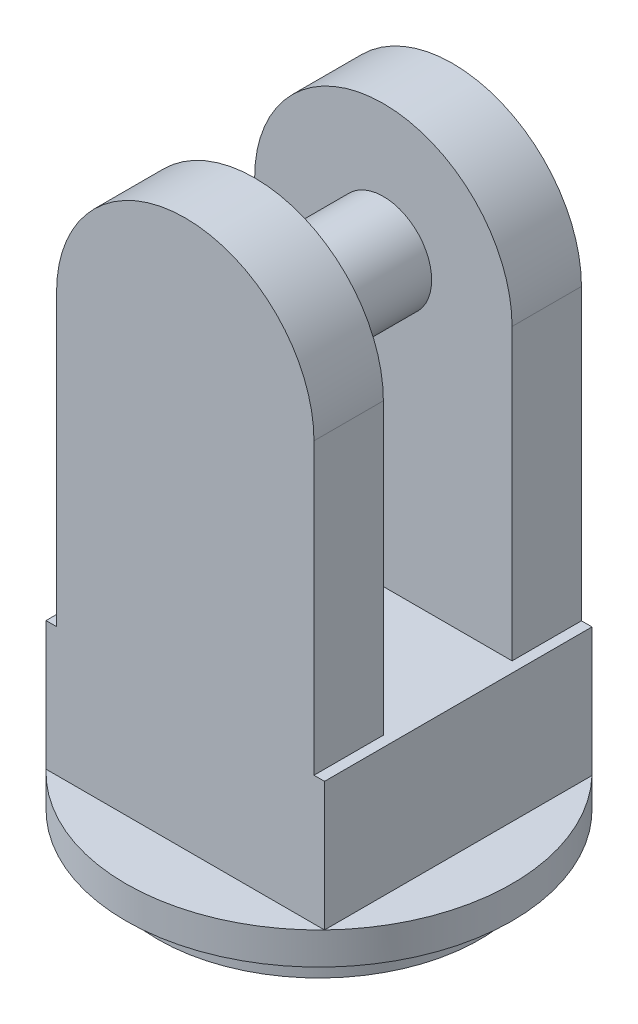
ISO-10303-21;
HEADER;
FILE_DESCRIPTION(('STEP AP214'),'2;1');
FILE_NAME('part.step','',(''),(''),'','','');
FILE_SCHEMA(('AUTOMOTIVE_DESIGN { 1 0 10303 214 1 1 1 1 }'));
ENDSEC;
DATA;
#1=APPLICATION_CONTEXT('core data for automotive mechanical design processes');
#2=APPLICATION_PROTOCOL_DEFINITION('international standard','automotive_design',2000,#1);
#3=PRODUCT_CONTEXT('',#1,'mechanical');
#4=PRODUCT('Part','Part','',(#3));
#5=PRODUCT_RELATED_PRODUCT_CATEGORY('part','',(#4));
#6=PRODUCT_DEFINITION_FORMATION('','',#4);
#7=PRODUCT_DEFINITION_CONTEXT('part definition',#1,'design');
#8=PRODUCT_DEFINITION('design','',#6,#7);
#9=PRODUCT_DEFINITION_SHAPE('','',#8);
#10=(LENGTH_UNIT() NAMED_UNIT(*) SI_UNIT(.MILLI.,.METRE.));
#11=(NAMED_UNIT(*) PLANE_ANGLE_UNIT() SI_UNIT($,.RADIAN.));
#12=(NAMED_UNIT(*) SI_UNIT($,.STERADIAN.) SOLID_ANGLE_UNIT());
#13=UNCERTAINTY_MEASURE_WITH_UNIT(LENGTH_MEASURE(1.E-05),#10,'distance_accuracy_value','');
#14=(GEOMETRIC_REPRESENTATION_CONTEXT(3) GLOBAL_UNCERTAINTY_ASSIGNED_CONTEXT((#13)) GLOBAL_UNIT_ASSIGNED_CONTEXT((#10,
#11,#12)) REPRESENTATION_CONTEXT('',''));
#15=CARTESIAN_POINT('',(0.,0.,0.));
#16=DIRECTION('',(0.,0.,1.));
#17=DIRECTION('',(1.,0.,0.));
#18=AXIS2_PLACEMENT_3D('',#15,#16,#17);
#19=CARTESIAN_POINT('',(-40.,60.,-229.445191334627));
#20=DIRECTION('',(-1.,0.,0.));
#21=DIRECTION('',(0.,0.,1.));
#22=AXIS2_PLACEMENT_3D('',#19,#20,#21);
#23=PLANE('',#22);
#24=DIRECTION('',(0.,1.,0.));
#25=VECTOR('',#24,1.);
#26=CARTESIAN_POINT('',(-40.,240.,20.));
#27=LINE('',#26,#25);
#28=CARTESIAN_POINT('',(-40.,60.,20.));
#29=VERTEX_POINT('',#28);
#30=CARTESIAN_POINT('',(-40.,150.,20.));
#31=VERTEX_POINT('',#30);
#32=EDGE_CURVE('E141',#29,#31,#27,.T.);
#33=ORIENTED_EDGE('',*,*,#32,.F.);
#34=DIRECTION('',(0.,0.,1.));
#35=VECTOR('',#34,1.);
#36=CARTESIAN_POINT('',(-40.,60.,-229.445191334627));
#37=LINE('',#36,#35);
#38=CARTESIAN_POINT('',(-40.,60.,41.5622490540678));
#39=VERTEX_POINT('',#38);
#40=EDGE_CURVE('E146',#29,#39,#37,.T.);
#41=ORIENTED_EDGE('',*,*,#40,.T.);
#42=DIRECTION('',(0.,-1.,0.));
#43=VECTOR('',#42,1.);
#44=CARTESIAN_POINT('',(-40.,60.,41.5622490540678));
#45=LINE('',#44,#43);
#46=CARTESIAN_POINT('',(-40.,150.,41.5622490540678));
#47=VERTEX_POINT('',#46);
#48=EDGE_CURVE('E152',#47,#39,#45,.T.);
#49=ORIENTED_EDGE('',*,*,#48,.F.);
#50=DIRECTION('',(0.,0.,1.));
#51=VECTOR('',#50,1.);
#52=CARTESIAN_POINT('',(-40.,150.,-229.445191334627));
#53=LINE('',#52,#51);
#54=EDGE_CURVE('E155',#31,#47,#53,.T.);
#55=ORIENTED_EDGE('',*,*,#54,.F.);
#56=EDGE_LOOP('',(#33,#41,#49,#55));
#57=FACE_BOUND('',#56,.T.);
#58=ADVANCED_FACE('F37',(#57),#23,.T.);
#59=CARTESIAN_POINT('',(0.,150.,-229.445191334627));
#60=DIRECTION('',(0.,0.,1.));
#61=DIRECTION('',(1.,0.,0.));
#62=AXIS2_PLACEMENT_3D('',#59,#60,#61);
#63=CYLINDRICAL_SURFACE('',#62,40.);
#64=CARTESIAN_POINT('',(0.,150.,20.));
#65=DIRECTION('',(0.,0.,1.));
#66=DIRECTION('',(0.,-1.,0.));
#67=AXIS2_PLACEMENT_3D('',#64,#65,#66);
#68=CIRCLE('',#67,40.);
#69=CARTESIAN_POINT('',(40.,150.,20.));
#70=VERTEX_POINT('',#69);
#71=EDGE_CURVE('E222',#31,#70,#68,.F.);
#72=ORIENTED_EDGE('',*,*,#71,.F.);
#73=ORIENTED_EDGE('',*,*,#54,.T.);
#74=CARTESIAN_POINT('',(0.,150.,41.5622490540678));
#75=DIRECTION('',(0.,0.,1.));
#76=DIRECTION('',(1.,0.,0.));
#77=AXIS2_PLACEMENT_3D('',#74,#75,#76);
#78=CIRCLE('',#77,40.);
#79=CARTESIAN_POINT('',(40.,150.,41.5622490540678));
#80=VERTEX_POINT('',#79);
#81=EDGE_CURVE('E235',#80,#47,#78,.T.);
#82=ORIENTED_EDGE('',*,*,#81,.F.);
#83=DIRECTION('',(0.,0.,1.));
#84=VECTOR('',#83,1.);
#85=CARTESIAN_POINT('',(40.,150.,-229.445191334627));
#86=LINE('',#85,#84);
#87=EDGE_CURVE('E159',#70,#80,#86,.T.);
#88=ORIENTED_EDGE('',*,*,#87,.F.);
#89=EDGE_LOOP('',(#72,#73,#82,#88));
#90=FACE_BOUND('',#89,.T.);
#91=ADVANCED_FACE('F279',(#90),#63,.T.);
#92=CARTESIAN_POINT('',(40.,60.,-229.445191334627));
#93=DIRECTION('',(1.,0.,0.));
#94=DIRECTION('',(0.,0.,-1.));
#95=AXIS2_PLACEMENT_3D('',#92,#93,#94);
#96=PLANE('',#95);
#97=DIRECTION('',(0.,-1.,0.));
#98=VECTOR('',#97,1.);
#99=CARTESIAN_POINT('',(40.,60.,20.));
#100=LINE('',#99,#98);
#101=CARTESIAN_POINT('',(40.,60.,20.));
#102=VERTEX_POINT('',#101);
#103=EDGE_CURVE('E11',#70,#102,#100,.T.);
#104=ORIENTED_EDGE('',*,*,#103,.F.);
#105=ORIENTED_EDGE('',*,*,#87,.T.);
#106=DIRECTION('',(0.,1.,0.));
#107=VECTOR('',#106,1.);
#108=CARTESIAN_POINT('',(40.,60.,41.5622490540678));
#109=LINE('',#108,#107);
#110=CARTESIAN_POINT('',(40.,60.,41.5622490540678));
#111=VERTEX_POINT('',#110);
#112=EDGE_CURVE('E233',#111,#80,#109,.T.);
#113=ORIENTED_EDGE('',*,*,#112,.F.);
#114=DIRECTION('',(0.,0.,1.));
#115=VECTOR('',#114,1.);
#116=CARTESIAN_POINT('',(40.,60.,-229.445191334627));
#117=LINE('',#116,#115);
#118=EDGE_CURVE('E60',#102,#111,#117,.T.);
#119=ORIENTED_EDGE('',*,*,#118,.F.);
#120=EDGE_LOOP('',(#104,#105,#113,#119));
#121=FACE_BOUND('',#120,.T.);
#122=ADVANCED_FACE('F275',(#121),#96,.T.);
#123=CARTESIAN_POINT('',(0.,20.,0.));
#124=DIRECTION('',(0.,1.,0.));
#125=DIRECTION('',(0.,0.,1.));
#126=AXIS2_PLACEMENT_3D('',#123,#124,#125);
#127=PLANE('',#126);
#128=DIRECTION('',(0.,0.,-1.));
#129=VECTOR('',#128,1.);
#130=CARTESIAN_POINT('',(43.2733111001185,20.,-41.5622490540678));
#131=LINE('',#130,#129);
#132=CARTESIAN_POINT('',(43.2733111001185,20.,41.5622490540678));
#133=VERTEX_POINT('',#132);
#134=CARTESIAN_POINT('',(43.2733111001185,20.,-41.5622490540678));
#135=VERTEX_POINT('',#134);
#136=EDGE_CURVE('E164',#133,#135,#131,.T.);
#137=ORIENTED_EDGE('',*,*,#136,.F.);
#138=CARTESIAN_POINT('',(0.,20.,0.));
#139=DIRECTION('',(0.,1.,0.));
#140=DIRECTION('',(0.,0.,1.));
#141=AXIS2_PLACEMENT_3D('',#138,#139,#140);
#142=CIRCLE('',#141,60.);
#143=EDGE_CURVE('E198',#133,#135,#142,.T.);
#144=ORIENTED_EDGE('',*,*,#143,.T.);
#145=EDGE_LOOP('',(#137,#144));
#146=FACE_BOUND('',#145,.T.);
#147=ADVANCED_FACE('F259',(#146),#127,.T.);
#148=DIRECTION('',(1.,0.,0.));
#149=VECTOR('',#148,1.);
#150=CARTESIAN_POINT('',(-43.2733111001185,20.,41.5622490540678));
#151=LINE('',#150,#149);
#152=CARTESIAN_POINT('',(-43.2733111001185,20.,41.5622490540678));
#153=VERTEX_POINT('',#152);
#154=EDGE_CURVE('E168',#153,#133,#151,.T.);
#155=ORIENTED_EDGE('',*,*,#154,.F.);
#156=EDGE_CURVE('E203',#153,#133,#142,.T.);
#157=ORIENTED_EDGE('',*,*,#156,.T.);
#158=EDGE_LOOP('',(#155,#157));
#159=FACE_BOUND('',#158,.T.);
#160=ADVANCED_FACE('F262',(#159),#127,.T.);
#161=DIRECTION('',(0.,0.,1.));
#162=VECTOR('',#161,1.);
#163=CARTESIAN_POINT('',(-43.2733111001185,20.,-41.5622490540678));
#164=LINE('',#163,#162);
#165=CARTESIAN_POINT('',(-43.2733111001185,20.,-41.5622490540678));
#166=VERTEX_POINT('',#165);
#167=EDGE_CURVE('E182',#166,#153,#164,.T.);
#168=ORIENTED_EDGE('',*,*,#167,.F.);
#169=EDGE_CURVE('E266',#166,#153,#142,.T.);
#170=ORIENTED_EDGE('',*,*,#169,.T.);
#171=EDGE_LOOP('',(#168,#170));
#172=FACE_BOUND('',#171,.T.);
#173=ADVANCED_FACE('F334',(#172),#127,.T.);
#174=CARTESIAN_POINT('',(0.,10.,0.));
#175=DIRECTION('',(0.,-1.,0.));
#176=DIRECTION('',(0.,0.,-1.));
#177=AXIS2_PLACEMENT_3D('',#174,#175,#176);
#178=CYLINDRICAL_SURFACE('',#177,50.);
#179=CARTESIAN_POINT('',(0.,10.,0.));
#180=DIRECTION('',(0.,1.,0.));
#181=DIRECTION('',(0.,0.,1.));
#182=AXIS2_PLACEMENT_3D('',#179,#180,#181);
#183=CIRCLE('',#182,50.);
#184=CARTESIAN_POINT('',(0.,10.,50.));
#185=VERTEX_POINT('',#184);
#186=EDGE_CURVE('E212',#185,#185,#183,.T.);
#187=ORIENTED_EDGE('',*,*,#186,.F.);
#188=EDGE_LOOP('',(#187));
#189=FACE_BOUND('',#188,.T.);
#190=CARTESIAN_POINT('',(0.,0.,0.));
#191=DIRECTION('',(0.,1.,0.));
#192=DIRECTION('',(0.,0.,1.));
#193=AXIS2_PLACEMENT_3D('',#190,#191,#192);
#194=CIRCLE('',#193,50.);
#195=CARTESIAN_POINT('',(0.,0.,50.));
#196=VERTEX_POINT('',#195);
#197=EDGE_CURVE('E209',#196,#196,#194,.T.);
#198=ORIENTED_EDGE('',*,*,#197,.T.);
#199=EDGE_LOOP('',(#198));
#200=FACE_BOUND('',#199,.T.);
#201=ADVANCED_FACE('F39',(#189,#200),#178,.T.);
#202=CARTESIAN_POINT('',(0.,0.,0.));
#203=DIRECTION('',(0.,1.,0.));
#204=DIRECTION('',(0.,0.,1.));
#205=AXIS2_PLACEMENT_3D('',#202,#203,#204);
#206=PLANE('',#205);
#207=CARTESIAN_POINT('',(0.,0.,0.));
#208=DIRECTION('',(0.,1.,0.));
#209=DIRECTION('',(0.,0.,1.));
#210=AXIS2_PLACEMENT_3D('',#207,#208,#209);
#211=CIRCLE('',#210,15.);
#212=CARTESIAN_POINT('',(0.,0.,15.));
#213=VERTEX_POINT('',#212);
#214=EDGE_CURVE('E206',#213,#213,#211,.T.);
#215=ORIENTED_EDGE('',*,*,#214,.T.);
#216=EDGE_LOOP('',(#215));
#217=FACE_BOUND('',#216,.T.);
#218=ORIENTED_EDGE('',*,*,#197,.F.);
#219=EDGE_LOOP('',(#218));
#220=FACE_BOUND('',#219,.T.);
#221=ADVANCED_FACE('F342',(#217,#220),#206,.F.);
#222=CARTESIAN_POINT('',(0.,0.,0.));
#223=DIRECTION('',(0.,1.,0.));
#224=DIRECTION('',(0.,0.,1.));
#225=AXIS2_PLACEMENT_3D('',#222,#223,#224);
#226=CYLINDRICAL_SURFACE('',#225,15.);
#227=ORIENTED_EDGE('',*,*,#214,.F.);
#228=EDGE_LOOP('',(#227));
#229=FACE_BOUND('',#228,.T.);
#230=CARTESIAN_POINT('',(0.,10.,0.));
#231=DIRECTION('',(0.,1.,0.));
#232=DIRECTION('',(0.,0.,1.));
#233=AXIS2_PLACEMENT_3D('',#230,#231,#232);
#234=CIRCLE('',#233,15.);
#235=CARTESIAN_POINT('',(0.,10.,15.));
#236=VERTEX_POINT('',#235);
#237=EDGE_CURVE('E201',#236,#236,#234,.T.);
#238=ORIENTED_EDGE('',*,*,#237,.T.);
#239=EDGE_LOOP('',(#238));
#240=FACE_BOUND('',#239,.T.);
#241=ADVANCED_FACE('F337',(#229,#240),#226,.F.);
#242=CARTESIAN_POINT('',(0.,10.,0.));
#243=DIRECTION('',(0.,1.,0.));
#244=DIRECTION('',(0.,0.,1.));
#245=AXIS2_PLACEMENT_3D('',#242,#243,#244);
#246=PLANE('',#245);
#247=ORIENTED_EDGE('',*,*,#186,.T.);
#248=EDGE_LOOP('',(#247));
#249=FACE_BOUND('',#248,.T.);
#250=CARTESIAN_POINT('',(0.,10.,0.));
#251=DIRECTION('',(0.,1.,0.));
#252=DIRECTION('',(0.,0.,1.));
#253=AXIS2_PLACEMENT_3D('',#250,#251,#252);
#254=CIRCLE('',#253,60.);
#255=CARTESIAN_POINT('',(0.,10.,60.));
#256=VERTEX_POINT('',#255);
#257=EDGE_CURVE('E197',#256,#256,#254,.T.);
#258=ORIENTED_EDGE('',*,*,#257,.F.);
#259=EDGE_LOOP('',(#258));
#260=FACE_BOUND('',#259,.T.);
#261=ADVANCED_FACE('F332',(#249,#260),#246,.F.);
#262=DIRECTION('',(-1.,0.,0.));
#263=VECTOR('',#262,1.);
#264=CARTESIAN_POINT('',(-43.2733111001185,20.,-41.5622490540678));
#265=LINE('',#264,#263);
#266=EDGE_CURVE('E180',#135,#166,#265,.T.);
#267=ORIENTED_EDGE('',*,*,#266,.F.);
#268=EDGE_CURVE('E202',#135,#166,#142,.T.);
#269=ORIENTED_EDGE('',*,*,#268,.T.);
#270=EDGE_LOOP('',(#267,#269));
#271=FACE_BOUND('',#270,.T.);
#272=ADVANCED_FACE('F329',(#271),#127,.T.);
#273=CARTESIAN_POINT('',(0.,20.,0.));
#274=DIRECTION('',(0.,-1.,0.));
#275=DIRECTION('',(0.,0.,-1.));
#276=AXIS2_PLACEMENT_3D('',#273,#274,#275);
#277=CYLINDRICAL_SURFACE('',#276,60.);
#278=ORIENTED_EDGE('',*,*,#143,.F.);
#279=ORIENTED_EDGE('',*,*,#156,.F.);
#280=ORIENTED_EDGE('',*,*,#169,.F.);
#281=ORIENTED_EDGE('',*,*,#268,.F.);
#282=EDGE_LOOP('',(#278,#279,#280,#281));
#283=FACE_BOUND('',#282,.T.);
#284=ORIENTED_EDGE('',*,*,#257,.T.);
#285=EDGE_LOOP('',(#284));
#286=FACE_BOUND('',#285,.T.);
#287=ADVANCED_FACE('F268',(#283,#286),#277,.T.);
#288=ORIENTED_EDGE('',*,*,#237,.F.);
#289=EDGE_LOOP('',(#288));
#290=FACE_BOUND('',#289,.T.);
#291=ADVANCED_FACE('F328',(#290),#246,.F.);
#292=CARTESIAN_POINT('',(43.2733111001185,60.,-41.5622490540678));
#293=DIRECTION('',(-1.,0.,0.));
#294=DIRECTION('',(0.,0.,1.));
#295=AXIS2_PLACEMENT_3D('',#292,#293,#294);
#296=PLANE('',#295);
#297=ORIENTED_EDGE('',*,*,#136,.T.);
#298=DIRECTION('',(0.,-1.,0.));
#299=VECTOR('',#298,1.);
#300=CARTESIAN_POINT('',(43.2733111001185,60.,-41.5622490540678));
#301=LINE('',#300,#299);
#302=CARTESIAN_POINT('',(43.2733111001185,60.,-41.5622490540678));
#303=VERTEX_POINT('',#302);
#304=EDGE_CURVE('E194',#303,#135,#301,.T.);
#305=ORIENTED_EDGE('',*,*,#304,.F.);
#306=DIRECTION('',(0.,0.,-1.));
#307=VECTOR('',#306,1.);
#308=CARTESIAN_POINT('',(43.2733111001185,60.,-41.5622490540678));
#309=LINE('',#308,#307);
#310=CARTESIAN_POINT('',(43.2733111001185,60.,41.5622490540678));
#311=VERTEX_POINT('',#310);
#312=EDGE_CURVE('E165',#311,#303,#309,.T.);
#313=ORIENTED_EDGE('',*,*,#312,.F.);
#314=DIRECTION('',(0.,-1.,0.));
#315=VECTOR('',#314,1.);
#316=CARTESIAN_POINT('',(43.2733111001185,60.,41.5622490540678));
#317=LINE('',#316,#315);
#318=EDGE_CURVE('E177',#311,#133,#317,.T.);
#319=ORIENTED_EDGE('',*,*,#318,.T.);
#320=EDGE_LOOP('',(#297,#305,#313,#319));
#321=FACE_BOUND('',#320,.T.);
#322=ADVANCED_FACE('F271',(#321),#296,.F.);
#323=CARTESIAN_POINT('',(-43.2733111001185,60.,-41.5622490540678));
#324=DIRECTION('',(0.,0.,1.));
#325=DIRECTION('',(1.,0.,0.));
#326=AXIS2_PLACEMENT_3D('',#323,#324,#325);
#327=PLANE('',#326);
#328=ORIENTED_EDGE('',*,*,#266,.T.);
#329=DIRECTION('',(0.,-1.,0.));
#330=VECTOR('',#329,1.);
#331=CARTESIAN_POINT('',(-43.2733111001185,60.,-41.5622490540678));
#332=LINE('',#331,#330);
#333=CARTESIAN_POINT('',(-43.2733111001185,60.,-41.5622490540678));
#334=VERTEX_POINT('',#333);
#335=EDGE_CURVE('E191',#334,#166,#332,.T.);
#336=ORIENTED_EDGE('',*,*,#335,.F.);
#337=DIRECTION('',(-1.,0.,0.));
#338=VECTOR('',#337,1.);
#339=CARTESIAN_POINT('',(-43.2733111001185,60.,-41.5622490540678));
#340=LINE('',#339,#338);
#341=CARTESIAN_POINT('',(-40.,60.,-41.5622490540678));
#342=VERTEX_POINT('',#341);
#343=EDGE_CURVE('E167',#342,#334,#340,.T.);
#344=ORIENTED_EDGE('',*,*,#343,.F.);
#345=DIRECTION('',(0.,1.,0.));
#346=VECTOR('',#345,1.);
#347=CARTESIAN_POINT('',(-40.,60.,-41.5622490540678));
#348=LINE('',#347,#346);
#349=CARTESIAN_POINT('',(-40.,150.,-41.5622490540678));
#350=VERTEX_POINT('',#349);
#351=EDGE_CURVE('E144',#342,#350,#348,.T.);
#352=ORIENTED_EDGE('',*,*,#351,.T.);
#353=CARTESIAN_POINT('',(0.,150.,-41.5622490540678));
#354=DIRECTION('',(0.,0.,1.));
#355=DIRECTION('',(1.,0.,0.));
#356=AXIS2_PLACEMENT_3D('',#353,#354,#355);
#357=CIRCLE('',#356,40.);
#358=CARTESIAN_POINT('',(40.,150.,-41.5622490540678));
#359=VERTEX_POINT('',#358);
#360=EDGE_CURVE('E145',#350,#359,#357,.F.);
#361=ORIENTED_EDGE('',*,*,#360,.T.);
#362=DIRECTION('',(0.,-1.,0.));
#363=VECTOR('',#362,1.);
#364=CARTESIAN_POINT('',(40.,60.,-41.5622490540678));
#365=LINE('',#364,#363);
#366=CARTESIAN_POINT('',(40.,60.,-41.5622490540678));
#367=VERTEX_POINT('',#366);
#368=EDGE_CURVE('E161',#359,#367,#365,.T.);
#369=ORIENTED_EDGE('',*,*,#368,.T.);
#370=EDGE_CURVE('E169',#303,#367,#340,.T.);
#371=ORIENTED_EDGE('',*,*,#370,.F.);
#372=ORIENTED_EDGE('',*,*,#304,.T.);
#373=EDGE_LOOP('',(#328,#336,#344,#352,#361,#369,#371,#372));
#374=FACE_BOUND('',#373,.T.);
#375=ADVANCED_FACE('F227',(#374),#327,.F.);
#376=CARTESIAN_POINT('',(-43.2733111001185,60.,-41.5622490540678));
#377=DIRECTION('',(1.,0.,0.));
#378=DIRECTION('',(0.,0.,-1.));
#379=AXIS2_PLACEMENT_3D('',#376,#377,#378);
#380=PLANE('',#379);
#381=ORIENTED_EDGE('',*,*,#167,.T.);
#382=DIRECTION('',(0.,-1.,0.));
#383=VECTOR('',#382,1.);
#384=CARTESIAN_POINT('',(-43.2733111001185,60.,41.5622490540678));
#385=LINE('',#384,#383);
#386=CARTESIAN_POINT('',(-43.2733111001185,60.,41.5622490540678));
#387=VERTEX_POINT('',#386);
#388=EDGE_CURVE('E188',#387,#153,#385,.T.);
#389=ORIENTED_EDGE('',*,*,#388,.F.);
#390=DIRECTION('',(0.,0.,1.));
#391=VECTOR('',#390,1.);
#392=CARTESIAN_POINT('',(-43.2733111001185,60.,-41.5622490540678));
#393=LINE('',#392,#391);
#394=EDGE_CURVE('E171',#334,#387,#393,.T.);
#395=ORIENTED_EDGE('',*,*,#394,.F.);
#396=ORIENTED_EDGE('',*,*,#335,.T.);
#397=EDGE_LOOP('',(#381,#389,#395,#396));
#398=FACE_BOUND('',#397,.T.);
#399=ADVANCED_FACE('F250',(#398),#380,.F.);
#400=CARTESIAN_POINT('',(-43.2733111001185,60.,41.5622490540678));
#401=DIRECTION('',(0.,0.,-1.));
#402=DIRECTION('',(-1.,0.,0.));
#403=AXIS2_PLACEMENT_3D('',#400,#401,#402);
#404=PLANE('',#403);
#405=ORIENTED_EDGE('',*,*,#154,.T.);
#406=ORIENTED_EDGE('',*,*,#318,.F.);
#407=DIRECTION('',(1.,0.,0.));
#408=VECTOR('',#407,1.);
#409=CARTESIAN_POINT('',(-43.2733111001185,60.,41.5622490540678));
#410=LINE('',#409,#408);
#411=EDGE_CURVE('E173',#111,#311,#410,.T.);
#412=ORIENTED_EDGE('',*,*,#411,.F.);
#413=ORIENTED_EDGE('',*,*,#112,.T.);
#414=ORIENTED_EDGE('',*,*,#81,.T.);
#415=ORIENTED_EDGE('',*,*,#48,.T.);
#416=EDGE_CURVE('E174',#387,#39,#410,.T.);
#417=ORIENTED_EDGE('',*,*,#416,.F.);
#418=ORIENTED_EDGE('',*,*,#388,.T.);
#419=EDGE_LOOP('',(#405,#406,#412,#413,#414,#415,#417,#418));
#420=FACE_BOUND('',#419,.T.);
#421=ADVANCED_FACE('F242',(#420),#404,.F.);
#422=CARTESIAN_POINT('',(0.,60.,0.));
#423=DIRECTION('',(0.,1.,0.));
#424=DIRECTION('',(0.,0.,1.));
#425=AXIS2_PLACEMENT_3D('',#422,#423,#424);
#426=PLANE('',#425);
#427=CARTESIAN_POINT('',(40.,60.,-20.));
#428=VERTEX_POINT('',#427);
#429=EDGE_CURVE('E130',#367,#428,#117,.T.);
#430=ORIENTED_EDGE('',*,*,#429,.T.);
#431=DIRECTION('',(-1.,0.,0.));
#432=VECTOR('',#431,1.);
#433=CARTESIAN_POINT('',(960.,60.,-20.));
#434=LINE('',#433,#432);
#435=CARTESIAN_POINT('',(-40.,60.,-20.));
#436=VERTEX_POINT('',#435);
#437=EDGE_CURVE('E52',#428,#436,#434,.T.);
#438=ORIENTED_EDGE('',*,*,#437,.T.);
#439=EDGE_CURVE('E127',#342,#436,#37,.T.);
#440=ORIENTED_EDGE('',*,*,#439,.F.);
#441=ORIENTED_EDGE('',*,*,#343,.T.);
#442=ORIENTED_EDGE('',*,*,#394,.T.);
#443=ORIENTED_EDGE('',*,*,#416,.T.);
#444=ORIENTED_EDGE('',*,*,#40,.F.);
#445=DIRECTION('',(-1.,0.,0.));
#446=VECTOR('',#445,1.);
#447=CARTESIAN_POINT('',(960.,60.,20.));
#448=LINE('',#447,#446);
#449=EDGE_CURVE('E131',#102,#29,#448,.T.);
#450=ORIENTED_EDGE('',*,*,#449,.F.);
#451=ORIENTED_EDGE('',*,*,#118,.T.);
#452=ORIENTED_EDGE('',*,*,#411,.T.);
#453=ORIENTED_EDGE('',*,*,#312,.T.);
#454=ORIENTED_EDGE('',*,*,#370,.T.);
#455=EDGE_LOOP('',(#430,#438,#440,#441,#442,#443,#444,#450,#451,#452,#453,#454));
#456=FACE_BOUND('',#455,.T.);
#457=ADVANCED_FACE('F125',(#456),#426,.T.);
#458=DIRECTION('',(0.,-1.,0.));
#459=VECTOR('',#458,1.);
#460=CARTESIAN_POINT('',(-40.,240.,-20.));
#461=LINE('',#460,#459);
#462=CARTESIAN_POINT('',(-40.,150.,-20.));
#463=VERTEX_POINT('',#462);
#464=EDGE_CURVE('E132',#463,#436,#461,.T.);
#465=ORIENTED_EDGE('',*,*,#464,.F.);
#466=EDGE_CURVE('E149',#350,#463,#53,.T.);
#467=ORIENTED_EDGE('',*,*,#466,.F.);
#468=ORIENTED_EDGE('',*,*,#351,.F.);
#469=ORIENTED_EDGE('',*,*,#439,.T.);
#470=EDGE_LOOP('',(#465,#467,#468,#469));
#471=FACE_BOUND('',#470,.T.);
#472=ADVANCED_FACE('F143',(#471),#23,.T.);
#473=CARTESIAN_POINT('',(0.,150.,-20.));
#474=DIRECTION('',(0.,0.,-1.));
#475=DIRECTION('',(0.,1.,0.));
#476=AXIS2_PLACEMENT_3D('',#473,#474,#475);
#477=CIRCLE('',#476,40.);
#478=CARTESIAN_POINT('',(40.,150.,-20.));
#479=VERTEX_POINT('',#478);
#480=EDGE_CURVE('E137',#479,#463,#477,.F.);
#481=ORIENTED_EDGE('',*,*,#480,.F.);
#482=EDGE_CURVE('E156',#359,#479,#86,.T.);
#483=ORIENTED_EDGE('',*,*,#482,.F.);
#484=ORIENTED_EDGE('',*,*,#360,.F.);
#485=ORIENTED_EDGE('',*,*,#466,.T.);
#486=EDGE_LOOP('',(#481,#483,#484,#485));
#487=FACE_BOUND('',#486,.T.);
#488=ADVANCED_FACE('F219',(#487),#63,.T.);
#489=DIRECTION('',(0.,1.,0.));
#490=VECTOR('',#489,1.);
#491=CARTESIAN_POINT('',(40.,60.,-20.));
#492=LINE('',#491,#490);
#493=EDGE_CURVE('E45',#428,#479,#492,.T.);
#494=ORIENTED_EDGE('',*,*,#493,.F.);
#495=ORIENTED_EDGE('',*,*,#429,.F.);
#496=ORIENTED_EDGE('',*,*,#368,.F.);
#497=ORIENTED_EDGE('',*,*,#482,.T.);
#498=EDGE_LOOP('',(#494,#495,#496,#497));
#499=FACE_BOUND('',#498,.T.);
#500=ADVANCED_FACE('F224',(#499),#96,.T.);
#501=CARTESIAN_POINT('',(960.,240.,20.));
#502=DIRECTION('',(0.,0.,1.));
#503=DIRECTION('',(0.,-1.,0.));
#504=AXIS2_PLACEMENT_3D('',#501,#502,#503);
#505=PLANE('',#504);
#506=CARTESIAN_POINT('',(0.,150.,20.));
#507=DIRECTION('',(0.,0.,1.));
#508=DIRECTION('',(0.,-1.,0.));
#509=AXIS2_PLACEMENT_3D('',#506,#507,#508);
#510=CIRCLE('',#509,15.);
#511=CARTESIAN_POINT('',(15.,150.,20.));
#512=VERTEX_POINT('',#511);
#513=EDGE_CURVE('E284',#512,#512,#510,.T.);
#514=ORIENTED_EDGE('',*,*,#513,.T.);
#515=EDGE_LOOP('',(#514));
#516=FACE_BOUND('',#515,.T.);
#517=ORIENTED_EDGE('',*,*,#71,.T.);
#518=ORIENTED_EDGE('',*,*,#103,.T.);
#519=ORIENTED_EDGE('',*,*,#449,.T.);
#520=ORIENTED_EDGE('',*,*,#32,.T.);
#521=EDGE_LOOP('',(#517,#518,#519,#520));
#522=FACE_BOUND('',#521,.T.);
#523=ADVANCED_FACE('F295',(#516,#522),#505,.F.);
#524=CARTESIAN_POINT('',(960.,240.,-20.));
#525=DIRECTION('',(0.,0.,-1.));
#526=DIRECTION('',(0.,1.,0.));
#527=AXIS2_PLACEMENT_3D('',#524,#525,#526);
#528=PLANE('',#527);
#529=CARTESIAN_POINT('',(0.,150.,-20.));
#530=DIRECTION('',(0.,0.,-1.));
#531=DIRECTION('',(0.,1.,0.));
#532=AXIS2_PLACEMENT_3D('',#529,#530,#531);
#533=CIRCLE('',#532,15.);
#534=CARTESIAN_POINT('',(15.,150.,-20.));
#535=VERTEX_POINT('',#534);
#536=EDGE_CURVE('E287',#535,#535,#533,.F.);
#537=ORIENTED_EDGE('',*,*,#536,.F.);
#538=EDGE_LOOP('',(#537));
#539=FACE_BOUND('',#538,.T.);
#540=ORIENTED_EDGE('',*,*,#480,.T.);
#541=ORIENTED_EDGE('',*,*,#464,.T.);
#542=ORIENTED_EDGE('',*,*,#437,.F.);
#543=ORIENTED_EDGE('',*,*,#493,.T.);
#544=EDGE_LOOP('',(#540,#541,#542,#543));
#545=FACE_BOUND('',#544,.T.);
#546=ADVANCED_FACE('F135',(#539,#545),#528,.F.);
#547=CARTESIAN_POINT('',(0.,150.,-62.4264068711929));
#548=DIRECTION('',(0.,0.,1.));
#549=DIRECTION('',(1.,0.,0.));
#550=AXIS2_PLACEMENT_3D('',#547,#548,#549);
#551=CYLINDRICAL_SURFACE('',#550,15.);
#552=CARTESIAN_POINT('',(15.,150.,-20.));
#553=CARTESIAN_POINT('',(15.,150.,-19.5833333333333));
#554=CARTESIAN_POINT('',(15.,150.,-19.1666666666667));
#555=CARTESIAN_POINT('',(15.,150.,-18.3333333333333));
#556=CARTESIAN_POINT('',(15.,150.,-17.9166666666667));
#557=CARTESIAN_POINT('',(15.,150.,-17.0833333333333));
#558=CARTESIAN_POINT('',(15.,150.,-16.6666666666667));
#559=CARTESIAN_POINT('',(15.,150.,-15.8333333333333));
#560=CARTESIAN_POINT('',(15.,150.,-15.4166666666667));
#561=CARTESIAN_POINT('',(15.,150.,-14.5833333333333));
#562=CARTESIAN_POINT('',(15.,150.,-14.1666666666667));
#563=CARTESIAN_POINT('',(15.,150.,-13.3333333333333));
#564=CARTESIAN_POINT('',(15.,150.,-12.9166666666667));
#565=CARTESIAN_POINT('',(15.,150.,-12.0833333333333));
#566=CARTESIAN_POINT('',(15.,150.,-11.6666666666667));
#567=CARTESIAN_POINT('',(15.,150.,-10.8333333333333));
#568=CARTESIAN_POINT('',(15.,150.,-10.4166666666667));
#569=CARTESIAN_POINT('',(15.,150.,-9.58333333333333));
#570=CARTESIAN_POINT('',(15.,150.,-9.16666666666666));
#571=CARTESIAN_POINT('',(15.,150.,-8.33333333333333));
#572=CARTESIAN_POINT('',(15.,150.,-7.91666666666666));
#573=CARTESIAN_POINT('',(15.,150.,-7.08333333333333));
#574=CARTESIAN_POINT('',(15.,150.,-6.66666666666666));
#575=CARTESIAN_POINT('',(15.,150.,-5.83333333333333));
#576=CARTESIAN_POINT('',(15.,150.,-5.41666666666666));
#577=CARTESIAN_POINT('',(15.,150.,-4.58333333333332));
#578=CARTESIAN_POINT('',(15.,150.,-4.16666666666666));
#579=CARTESIAN_POINT('',(15.,150.,-3.33333333333332));
#580=CARTESIAN_POINT('',(15.,150.,-2.91666666666666));
#581=CARTESIAN_POINT('',(15.,150.,-2.08333333333332));
#582=CARTESIAN_POINT('',(15.,150.,-1.66666666666666));
#583=CARTESIAN_POINT('',(15.,150.,-0.833333333333327));
#584=CARTESIAN_POINT('',(15.,150.,-0.41666666666666));
#585=CARTESIAN_POINT('',(15.,150.,0.416666666666674));
#586=CARTESIAN_POINT('',(15.,150.,0.833333333333341));
#587=CARTESIAN_POINT('',(15.,150.,1.66666666666667));
#588=CARTESIAN_POINT('',(15.,150.,2.08333333333333));
#589=CARTESIAN_POINT('',(15.,150.,2.91666666666666));
#590=CARTESIAN_POINT('',(15.,150.,3.33333333333333));
#591=CARTESIAN_POINT('',(15.,150.,4.16666666666666));
#592=CARTESIAN_POINT('',(15.,150.,4.58333333333333));
#593=CARTESIAN_POINT('',(15.,150.,5.41666666666666));
#594=CARTESIAN_POINT('',(15.,150.,5.83333333333333));
#595=CARTESIAN_POINT('',(15.,150.,6.66666666666667));
#596=CARTESIAN_POINT('',(15.,150.,7.08333333333333));
#597=CARTESIAN_POINT('',(15.,150.,7.91666666666667));
#598=CARTESIAN_POINT('',(15.,150.,8.33333333333333));
#599=CARTESIAN_POINT('',(15.,150.,9.16666666666667));
#600=CARTESIAN_POINT('',(15.,150.,9.58333333333333));
#601=CARTESIAN_POINT('',(15.,150.,10.4166666666667));
#602=CARTESIAN_POINT('',(15.,150.,10.8333333333333));
#603=CARTESIAN_POINT('',(15.,150.,11.6666666666667));
#604=CARTESIAN_POINT('',(15.,150.,12.0833333333333));
#605=CARTESIAN_POINT('',(15.,150.,12.9166666666667));
#606=CARTESIAN_POINT('',(15.,150.,13.3333333333333));
#607=CARTESIAN_POINT('',(15.,150.,14.1666666666667));
#608=CARTESIAN_POINT('',(15.,150.,14.5833333333333));
#609=CARTESIAN_POINT('',(15.,150.,15.4166666666667));
#610=CARTESIAN_POINT('',(15.,150.,15.8333333333333));
#611=CARTESIAN_POINT('',(15.,150.,16.6666666666667));
#612=CARTESIAN_POINT('',(15.,150.,17.0833333333333));
#613=CARTESIAN_POINT('',(15.,150.,17.9166666666667));
#614=CARTESIAN_POINT('',(15.,150.,18.3333333333333));
#615=CARTESIAN_POINT('',(15.,150.,19.1666666666667));
#616=CARTESIAN_POINT('',(15.,150.,19.5833333333333));
#617=CARTESIAN_POINT('',(15.,150.,20.));
#618=B_SPLINE_CURVE_WITH_KNOTS('',3,(#552,#553,#554,#555,#556,#557,#558,#559,#560,#561,#562,
#563,#564,#565,#566,#567,#568,#569,#570,#571,#572,#573,#574,#575,#576,#577,#578,#579,#580,#581,
#582,#583,#584,#585,#586,#587,#588,#589,#590,#591,#592,#593,#594,#595,#596,#597,#598,#599,#600,
#601,#602,#603,#604,#605,#606,#607,#608,#609,#610,#611,#612,#613,#614,#615,#616,#617),
.UNSPECIFIED.,.F.,.F.,(4,2,2,2,2,2,2,2,2,2,2,2,2,2,2,2,2,2,2,2,2,2,2,2,2,2,2,2,2,2,2,2,4),(0.,
1.25,2.5,3.75,5.,6.25,7.5,8.75,9.99999999999999,11.25,12.5,13.75,15.,16.25,17.5,18.75,20.,21.25,
22.5,23.75,25.,26.25,27.5,28.75,30.,31.25,32.5,33.75,35.,36.25,37.5,38.75,40.),.UNSPECIFIED.);
#619=EDGE_CURVE('BSEAM291',#535,#512,#618,.T.);
#620=ORIENTED_EDGE('',*,*,#536,.T.);
#621=ORIENTED_EDGE('',*,*,#513,.F.);
#622=ORIENTED_EDGE('',*,*,#619,.T.);
#623=ORIENTED_EDGE('',*,*,#619,.F.);
#624=EDGE_LOOP('',(#620,#622,#621,#623));
#625=FACE_BOUND('',#624,.T.);
#626=ADVANCED_FACE('F291',(#625),#551,.T.);
#627=CLOSED_SHELL('',(#58,#91,#122,#147,#160,#173,#201,#221,#241,#261,#272,#287,#291,#322,#375,
#399,#421,#457,#472,#488,#500,#523,#546,#626));
#628=MANIFOLD_SOLID_BREP('B2',#627);
#629=ADVANCED_BREP_SHAPE_REPRESENTATION('',(#18,#628),#14);
#630=SHAPE_DEFINITION_REPRESENTATION(#9,#629);
ENDSEC;
END-ISO-10303-21;
